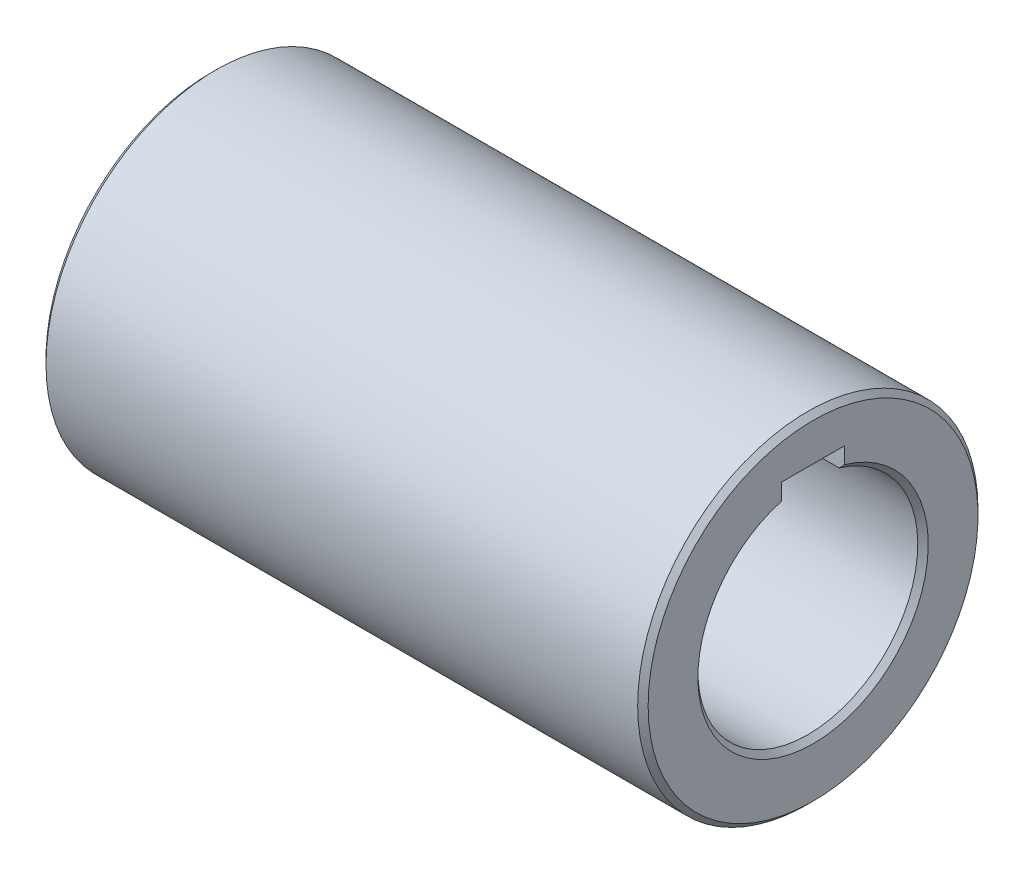
ISO-10303-21;
HEADER;
FILE_DESCRIPTION(('STEP AP214'),'2;1');
FILE_NAME('part.step','',(''),(''),'','','');
FILE_SCHEMA(('AUTOMOTIVE_DESIGN { 1 0 10303 214 1 1 1 1 }'));
ENDSEC;
DATA;
#1=APPLICATION_CONTEXT('core data for automotive mechanical design processes');
#2=APPLICATION_PROTOCOL_DEFINITION('international standard','automotive_design',2000,#1);
#3=PRODUCT_CONTEXT('',#1,'mechanical');
#4=PRODUCT('Part','Part','',(#3));
#5=PRODUCT_RELATED_PRODUCT_CATEGORY('part','',(#4));
#6=PRODUCT_DEFINITION_FORMATION('','',#4);
#7=PRODUCT_DEFINITION_CONTEXT('part definition',#1,'design');
#8=PRODUCT_DEFINITION('design','',#6,#7);
#9=PRODUCT_DEFINITION_SHAPE('','',#8);
#10=(LENGTH_UNIT() NAMED_UNIT(*) SI_UNIT(.MILLI.,.METRE.));
#11=(NAMED_UNIT(*) PLANE_ANGLE_UNIT() SI_UNIT($,.RADIAN.));
#12=(NAMED_UNIT(*) SI_UNIT($,.STERADIAN.) SOLID_ANGLE_UNIT());
#13=UNCERTAINTY_MEASURE_WITH_UNIT(LENGTH_MEASURE(1.E-05),#10,'distance_accuracy_value','');
#14=(GEOMETRIC_REPRESENTATION_CONTEXT(3) GLOBAL_UNCERTAINTY_ASSIGNED_CONTEXT((#13)) GLOBAL_UNIT_ASSIGNED_CONTEXT((#10,
#11,#12)) REPRESENTATION_CONTEXT('',''));
#15=CARTESIAN_POINT('',(0.,0.,0.));
#16=DIRECTION('',(0.,0.,1.));
#17=DIRECTION('',(1.,0.,0.));
#18=AXIS2_PLACEMENT_3D('',#15,#16,#17);
#19=CARTESIAN_POINT('',(0.,0.,0.));
#20=DIRECTION('',(-1.,0.,0.));
#21=DIRECTION('',(0.,0.,1.));
#22=AXIS2_PLACEMENT_3D('',#19,#20,#21);
#23=CYLINDRICAL_SURFACE('',#22,27.5);
#24=CARTESIAN_POINT('',(0.999999999999963,0.,0.));
#25=DIRECTION('',(1.,0.,0.));
#26=DIRECTION('',(0.,0.,-1.));
#27=AXIS2_PLACEMENT_3D('',#24,#25,#26);
#28=CIRCLE('',#27,27.5);
#29=CARTESIAN_POINT('',(0.999999999999963,0.,-27.5));
#30=VERTEX_POINT('',#29);
#31=EDGE_CURVE('E155',#30,#30,#28,.F.);
#32=ORIENTED_EDGE('',*,*,#31,.T.);
#33=EDGE_LOOP('',(#32));
#34=FACE_BOUND('',#33,.T.);
#35=CARTESIAN_POINT('',(63.,0.,0.));
#36=DIRECTION('',(-1.,0.,0.));
#37=DIRECTION('',(0.,0.,1.));
#38=AXIS2_PLACEMENT_3D('',#35,#36,#37);
#39=CIRCLE('',#38,27.5);
#40=CARTESIAN_POINT('',(63.,0.,27.5));
#41=VERTEX_POINT('',#40);
#42=EDGE_CURVE('E128',#41,#41,#39,.T.);
#43=ORIENTED_EDGE('',*,*,#42,.F.);
#44=EDGE_LOOP('',(#43));
#45=FACE_BOUND('',#44,.T.);
#46=ADVANCED_FACE('F38',(#34,#45),#23,.F.);
#47=CARTESIAN_POINT('',(0.,27.5,0.));
#48=DIRECTION('',(1.,0.,0.));
#49=DIRECTION('',(0.,0.,-1.));
#50=AXIS2_PLACEMENT_3D('',#47,#48,#49);
#51=PLANE('',#50);
#52=CARTESIAN_POINT('',(0.,0.,0.));
#53=DIRECTION('',(1.,0.,0.));
#54=DIRECTION('',(0.,0.,-1.));
#55=AXIS2_PLACEMENT_3D('',#52,#53,#54);
#56=CIRCLE('',#55,28.5);
#57=CARTESIAN_POINT('',(0.,0.,-28.5));
#58=VERTEX_POINT('',#57);
#59=EDGE_CURVE('E163',#58,#58,#56,.T.);
#60=ORIENTED_EDGE('',*,*,#59,.T.);
#61=EDGE_LOOP('',(#60));
#62=FACE_BOUND('',#61,.T.);
#63=CARTESIAN_POINT('',(0.,0.,0.));
#64=DIRECTION('',(1.,0.,0.));
#65=DIRECTION('',(0.,0.,-1.));
#66=AXIS2_PLACEMENT_3D('',#63,#64,#65);
#67=CIRCLE('',#66,31.5);
#68=CARTESIAN_POINT('',(0.,0.,-31.5));
#69=VERTEX_POINT('',#68);
#70=EDGE_CURVE('E159',#69,#69,#67,.F.);
#71=ORIENTED_EDGE('',*,*,#70,.T.);
#72=EDGE_LOOP('',(#71));
#73=FACE_BOUND('',#72,.T.);
#74=ADVANCED_FACE('F206',(#62,#73),#51,.F.);
#75=CARTESIAN_POINT('',(0.,0.,0.));
#76=DIRECTION('',(-1.,0.,0.));
#77=DIRECTION('',(0.,0.,1.));
#78=AXIS2_PLACEMENT_3D('',#75,#76,#77);
#79=CYLINDRICAL_SURFACE('',#78,32.5);
#80=CARTESIAN_POINT('',(114.,0.,0.));
#81=DIRECTION('',(-1.,0.,0.));
#82=DIRECTION('',(0.,0.,1.));
#83=AXIS2_PLACEMENT_3D('',#80,#81,#82);
#84=CIRCLE('',#83,32.5);
#85=CARTESIAN_POINT('',(114.,0.,32.5));
#86=VERTEX_POINT('',#85);
#87=EDGE_CURVE('E151',#86,#86,#84,.T.);
#88=ORIENTED_EDGE('',*,*,#87,.T.);
#89=EDGE_LOOP('',(#88));
#90=FACE_BOUND('',#89,.T.);
#91=CARTESIAN_POINT('',(0.999999999999994,0.,0.));
#92=DIRECTION('',(1.,0.,0.));
#93=DIRECTION('',(0.,0.,-1.));
#94=AXIS2_PLACEMENT_3D('',#91,#92,#93);
#95=CIRCLE('',#94,32.5);
#96=CARTESIAN_POINT('',(0.999999999999994,0.,-32.5));
#97=VERTEX_POINT('',#96);
#98=EDGE_CURVE('E147',#97,#97,#95,.T.);
#99=ORIENTED_EDGE('',*,*,#98,.T.);
#100=EDGE_LOOP('',(#99));
#101=FACE_BOUND('',#100,.T.);
#102=ADVANCED_FACE('F203',(#90,#101),#79,.T.);
#103=CARTESIAN_POINT('',(115.,21.,0.));
#104=DIRECTION('',(-1.,0.,0.));
#105=DIRECTION('',(0.,0.,1.));
#106=AXIS2_PLACEMENT_3D('',#103,#104,#105);
#107=PLANE('',#106);
#108=DIRECTION('',(0.,0.,1.));
#109=VECTOR('',#108,1.);
#110=CARTESIAN_POINT('',(115.,24.3,-6.));
#111=LINE('',#110,#109);
#112=CARTESIAN_POINT('',(115.,24.3,-6.));
#113=VERTEX_POINT('',#112);
#114=CARTESIAN_POINT('',(115.,24.3,6.));
#115=VERTEX_POINT('',#114);
#116=EDGE_CURVE('E92',#113,#115,#111,.T.);
#117=ORIENTED_EDGE('',*,*,#116,.F.);
#118=DIRECTION('',(0.,1.,0.));
#119=VECTOR('',#118,1.);
#120=CARTESIAN_POINT('',(115.,16.,-6.));
#121=LINE('',#120,#119);
#122=CARTESIAN_POINT('',(115.,21.1660104885167,-6.));
#123=VERTEX_POINT('',#122);
#124=EDGE_CURVE('E97',#123,#113,#121,.T.);
#125=ORIENTED_EDGE('',*,*,#124,.F.);
#126=CARTESIAN_POINT('',(115.,0.,0.));
#127=DIRECTION('',(-1.,0.,0.));
#128=DIRECTION('',(0.,0.,1.));
#129=AXIS2_PLACEMENT_3D('',#126,#127,#128);
#130=CIRCLE('',#129,22.);
#131=CARTESIAN_POINT('',(115.,21.1660104885167,6.));
#132=VERTEX_POINT('',#131);
#133=EDGE_CURVE('E140',#123,#132,#130,.T.);
#134=ORIENTED_EDGE('',*,*,#133,.T.);
#135=DIRECTION('',(0.,-1.,0.));
#136=VECTOR('',#135,1.);
#137=CARTESIAN_POINT('',(115.,16.,6.));
#138=LINE('',#137,#136);
#139=EDGE_CURVE('E55',#115,#132,#138,.T.);
#140=ORIENTED_EDGE('',*,*,#139,.F.);
#141=EDGE_LOOP('',(#117,#125,#134,#140));
#142=FACE_BOUND('',#141,.T.);
#143=CARTESIAN_POINT('',(115.,0.,0.));
#144=DIRECTION('',(-1.,0.,0.));
#145=DIRECTION('',(0.,0.,1.));
#146=AXIS2_PLACEMENT_3D('',#143,#144,#145);
#147=CIRCLE('',#146,31.5);
#148=CARTESIAN_POINT('',(115.,0.,31.5));
#149=VERTEX_POINT('',#148);
#150=EDGE_CURVE('E136',#149,#149,#147,.F.);
#151=ORIENTED_EDGE('',*,*,#150,.T.);
#152=EDGE_LOOP('',(#151));
#153=FACE_BOUND('',#152,.T.);
#154=ADVANCED_FACE('F105',(#142,#153),#107,.F.);
#155=CARTESIAN_POINT('',(0.,0.,0.));
#156=DIRECTION('',(-1.,0.,0.));
#157=DIRECTION('',(0.,0.,1.));
#158=AXIS2_PLACEMENT_3D('',#155,#156,#157);
#159=CYLINDRICAL_SURFACE('',#158,21.);
#160=CARTESIAN_POINT('',(114.,0.,0.));
#161=DIRECTION('',(-1.,0.,0.));
#162=DIRECTION('',(0.,0.,1.));
#163=AXIS2_PLACEMENT_3D('',#160,#161,#162);
#164=CIRCLE('',#163,21.);
#165=CARTESIAN_POINT('',(114.,20.1246117974981,6.));
#166=VERTEX_POINT('',#165);
#167=CARTESIAN_POINT('',(114.,20.1246117974981,-6.));
#168=VERTEX_POINT('',#167);
#169=EDGE_CURVE('E143',#166,#168,#164,.F.);
#170=ORIENTED_EDGE('',*,*,#169,.T.);
#171=DIRECTION('',(-1.,0.,0.));
#172=VECTOR('',#171,1.);
#173=CARTESIAN_POINT('',(0.,20.1246117974981,-6.));
#174=LINE('',#173,#172);
#175=CARTESIAN_POINT('',(63.,20.1246117974981,-6.));
#176=VERTEX_POINT('',#175);
#177=EDGE_CURVE('E123',#168,#176,#174,.T.);
#178=ORIENTED_EDGE('',*,*,#177,.T.);
#179=CARTESIAN_POINT('',(63.,0.,0.));
#180=DIRECTION('',(-1.,0.,0.));
#181=DIRECTION('',(0.,0.,1.));
#182=AXIS2_PLACEMENT_3D('',#179,#180,#181);
#183=CIRCLE('',#182,21.);
#184=CARTESIAN_POINT('',(63.,20.1246117974981,6.));
#185=VERTEX_POINT('',#184);
#186=EDGE_CURVE('E132',#176,#185,#183,.T.);
#187=ORIENTED_EDGE('',*,*,#186,.T.);
#188=DIRECTION('',(-1.,0.,0.));
#189=VECTOR('',#188,1.);
#190=CARTESIAN_POINT('',(0.,20.1246117974981,6.));
#191=LINE('',#190,#189);
#192=EDGE_CURVE('E114',#185,#166,#191,.F.);
#193=ORIENTED_EDGE('',*,*,#192,.T.);
#194=EDGE_LOOP('',(#170,#178,#187,#193));
#195=FACE_BOUND('',#194,.T.);
#196=ADVANCED_FACE('F196',(#195),#159,.F.);
#197=CARTESIAN_POINT('',(63.,27.5,0.));
#198=DIRECTION('',(1.,0.,0.));
#199=DIRECTION('',(0.,0.,-1.));
#200=AXIS2_PLACEMENT_3D('',#197,#198,#199);
#201=PLANE('',#200);
#202=ORIENTED_EDGE('',*,*,#186,.F.);
#203=DIRECTION('',(0.,1.,0.));
#204=VECTOR('',#203,1.);
#205=CARTESIAN_POINT('',(63.,27.5,-6.));
#206=LINE('',#205,#204);
#207=CARTESIAN_POINT('',(63.,24.3,-6.));
#208=VERTEX_POINT('',#207);
#209=EDGE_CURVE('E63',#176,#208,#206,.T.);
#210=ORIENTED_EDGE('',*,*,#209,.T.);
#211=DIRECTION('',(0.,0.,1.));
#212=VECTOR('',#211,1.);
#213=CARTESIAN_POINT('',(63.,24.3,0.));
#214=LINE('',#213,#212);
#215=CARTESIAN_POINT('',(63.,24.3,6.));
#216=VERTEX_POINT('',#215);
#217=EDGE_CURVE('E11',#208,#216,#214,.T.);
#218=ORIENTED_EDGE('',*,*,#217,.T.);
#219=DIRECTION('',(0.,-1.,0.));
#220=VECTOR('',#219,1.);
#221=CARTESIAN_POINT('',(63.,27.5,6.));
#222=LINE('',#221,#220);
#223=EDGE_CURVE('E119',#216,#185,#222,.T.);
#224=ORIENTED_EDGE('',*,*,#223,.T.);
#225=EDGE_LOOP('',(#202,#210,#218,#224));
#226=FACE_BOUND('',#225,.T.);
#227=ORIENTED_EDGE('',*,*,#42,.T.);
#228=EDGE_LOOP('',(#227));
#229=FACE_BOUND('',#228,.T.);
#230=ADVANCED_FACE('F193',(#226,#229),#201,.F.);
#231=CARTESIAN_POINT('',(115.,0.,0.));
#232=DIRECTION('',(1.,0.,0.));
#233=DIRECTION('',(0.,0.,-1.));
#234=AXIS2_PLACEMENT_3D('',#231,#232,#233);
#235=CONICAL_SURFACE('',#234,22.,0.785398163397445);
#236=CARTESIAN_POINT('',(107.917037469702,13.6571595462779,-6.));
#237=CARTESIAN_POINT('',(108.185169465987,13.9500097881322,-6.));
#238=CARTESIAN_POINT('',(108.454042430695,14.2421797525251,-6.));
#239=CARTESIAN_POINT('',(108.993064652202,14.8253372360777,-6.));
#240=CARTESIAN_POINT('',(109.263213901869,15.1163247618273,-6.));
#241=CARTESIAN_POINT('',(109.804580459783,15.6972927477288,-6.));
#242=CARTESIAN_POINT('',(110.075797745874,15.9872732285393,-6.));
#243=CARTESIAN_POINT('',(110.619154078413,16.5663699176533,-6.));
#244=CARTESIAN_POINT('',(110.891293126352,16.855486124557,-6.));
#245=CARTESIAN_POINT('',(111.708863977728,17.7216841881823,-6.));
#246=CARTESIAN_POINT('',(112.25548011204,18.2976482901069,-6.));
#247=CARTESIAN_POINT('',(113.351102236773,19.4473032313742,-6.));
#248=CARTESIAN_POINT('',(113.900108241998,20.0209940565921,-6.));
#249=CARTESIAN_POINT('',(114.999949542925,21.1665642341172,-6.));
#250=CARTESIAN_POINT('',(115.550784746656,21.7384436747571,-6.));
#251=CARTESIAN_POINT('',(116.653926148128,22.8807821014784,-6.));
#252=CARTESIAN_POINT('',(117.206232346738,23.4512410867213,-6.));
#253=CARTESIAN_POINT('',(118.312056434325,24.5910415798011,-6.));
#254=CARTESIAN_POINT('',(118.865574385813,25.1603830269714,-6.));
#255=CARTESIAN_POINT('',(119.973587219625,26.2981148054165,-6.));
#256=CARTESIAN_POINT('',(120.52808210211,26.8665051365345,-6.));
#257=CARTESIAN_POINT('',(121.082962530298,27.4345181200277,-6.));
#258=B_SPLINE_CURVE_WITH_KNOTS('',3,(#236,#237,#238,#239,#240,#241,#242,#243,#244,#245,#246,
#247,#248,#249,#250,#251,#252,#253,#254,#255,#256,#257),.UNSPECIFIED.,.F.,.F.,(4,2,2,2,2,2,2,2,
2,2,4),(0.,1.19117443272705,2.38234221774085,3.57348542086152,4.76463055209766,7.14678619121553,
9.52895660857309,11.9110090126714,14.2930628224653,16.6752425534105,19.0574226769363),.UNSPECIFIED.);
#259=EDGE_CURVE('E48',#168,#123,#258,.T.);
#260=ORIENTED_EDGE('',*,*,#259,.F.);
#261=ORIENTED_EDGE('',*,*,#169,.F.);
#262=CARTESIAN_POINT('',(121.082962530298,27.4345181200277,6.));
#263=CARTESIAN_POINT('',(120.52808210211,26.8665051365345,6.));
#264=CARTESIAN_POINT('',(119.973587219625,26.2981148054165,6.));
#265=CARTESIAN_POINT('',(118.865574385813,25.1603830269714,6.));
#266=CARTESIAN_POINT('',(118.312056434325,24.5910415798011,6.));
#267=CARTESIAN_POINT('',(117.206232346738,23.4512410867213,6.));
#268=CARTESIAN_POINT('',(116.653926148128,22.8807821014784,6.));
#269=CARTESIAN_POINT('',(115.550784746656,21.7384436747571,6.));
#270=CARTESIAN_POINT('',(114.999949542925,21.1665642341171,6.));
#271=CARTESIAN_POINT('',(113.900108241998,20.0209940565921,6.));
#272=CARTESIAN_POINT('',(113.351102236773,19.4473032313742,6.));
#273=CARTESIAN_POINT('',(112.25548011204,18.2976482901069,6.));
#274=CARTESIAN_POINT('',(111.708863977728,17.7216841881822,6.));
#275=CARTESIAN_POINT('',(110.891293126352,16.855486124557,6.));
#276=CARTESIAN_POINT('',(110.619154078413,16.5663699176533,6.));
#277=CARTESIAN_POINT('',(110.075797745874,15.9872732285393,6.));
#278=CARTESIAN_POINT('',(109.804580459783,15.6972927477287,6.));
#279=CARTESIAN_POINT('',(109.263213901869,15.1163247618273,6.));
#280=CARTESIAN_POINT('',(108.993064652202,14.8253372360777,6.));
#281=CARTESIAN_POINT('',(108.454042430695,14.242179752525,6.));
#282=CARTESIAN_POINT('',(108.185169465987,13.9500097881321,6.));
#283=CARTESIAN_POINT('',(107.917037469702,13.6571595462779,6.));
#284=B_SPLINE_CURVE_WITH_KNOTS('',3,(#262,#263,#264,#265,#266,#267,#268,#269,#270,#271,#272,
#273,#274,#275,#276,#277,#278,#279,#280,#281,#282,#283),.UNSPECIFIED.,.F.,.F.,(4,2,2,2,2,2,2,2,
2,2,4),(0.,2.38218012352581,4.76435985447098,7.14641366426495,9.52846606836322,11.9106364857208,
14.2927921248387,15.4839372560748,16.6750804591954,17.8662482442093,19.0574226769363),.UNSPECIFIED.);
#285=EDGE_CURVE('E167',#132,#166,#284,.T.);
#286=ORIENTED_EDGE('',*,*,#285,.F.);
#287=ORIENTED_EDGE('',*,*,#133,.F.);
#288=EDGE_LOOP('',(#260,#261,#286,#287));
#289=FACE_BOUND('',#288,.T.);
#290=ADVANCED_FACE('F181',(#289),#235,.F.);
#291=CARTESIAN_POINT('',(114.,0.,0.));
#292=DIRECTION('',(-1.,0.,0.));
#293=DIRECTION('',(0.,0.,1.));
#294=AXIS2_PLACEMENT_3D('',#291,#292,#293);
#295=CONICAL_SURFACE('',#294,32.5,0.785398163397438);
#296=ORIENTED_EDGE('',*,*,#150,.F.);
#297=EDGE_LOOP('',(#296));
#298=FACE_BOUND('',#297,.T.);
#299=ORIENTED_EDGE('',*,*,#87,.F.);
#300=EDGE_LOOP('',(#299));
#301=FACE_BOUND('',#300,.T.);
#302=ADVANCED_FACE('F221',(#298,#301),#295,.T.);
#303=CARTESIAN_POINT('',(0.999999999999963,0.,0.));
#304=DIRECTION('',(-1.,0.,0.));
#305=DIRECTION('',(0.,0.,1.));
#306=AXIS2_PLACEMENT_3D('',#303,#304,#305);
#307=CONICAL_SURFACE('',#306,27.5,0.785398163397462);
#308=ORIENTED_EDGE('',*,*,#59,.F.);
#309=EDGE_LOOP('',(#308));
#310=FACE_BOUND('',#309,.T.);
#311=ORIENTED_EDGE('',*,*,#31,.F.);
#312=EDGE_LOOP('',(#311));
#313=FACE_BOUND('',#312,.T.);
#314=ADVANCED_FACE('F219',(#310,#313),#307,.F.);
#315=CARTESIAN_POINT('',(0.,0.,0.));
#316=DIRECTION('',(1.,0.,0.));
#317=DIRECTION('',(0.,0.,-1.));
#318=AXIS2_PLACEMENT_3D('',#315,#316,#317);
#319=CONICAL_SURFACE('',#318,31.5,0.785398163397448);
#320=ORIENTED_EDGE('',*,*,#98,.F.);
#321=EDGE_LOOP('',(#320));
#322=FACE_BOUND('',#321,.T.);
#323=ORIENTED_EDGE('',*,*,#70,.F.);
#324=EDGE_LOOP('',(#323));
#325=FACE_BOUND('',#324,.T.);
#326=ADVANCED_FACE('F41',(#322,#325),#319,.T.);
#327=CARTESIAN_POINT('',(15.,24.3,-6.));
#328=DIRECTION('',(0.,1.,0.));
#329=DIRECTION('',(0.,0.,1.));
#330=AXIS2_PLACEMENT_3D('',#327,#328,#329);
#331=PLANE('',#330);
#332=DIRECTION('',(1.,0.,0.));
#333=VECTOR('',#332,1.);
#334=CARTESIAN_POINT('',(15.,24.3,-6.));
#335=LINE('',#334,#333);
#336=EDGE_CURVE('E87',#208,#113,#335,.T.);
#337=ORIENTED_EDGE('',*,*,#336,.T.);
#338=ORIENTED_EDGE('',*,*,#116,.T.);
#339=DIRECTION('',(1.,0.,0.));
#340=VECTOR('',#339,1.);
#341=CARTESIAN_POINT('',(15.,24.3,6.));
#342=LINE('',#341,#340);
#343=EDGE_CURVE('E94',#216,#115,#342,.T.);
#344=ORIENTED_EDGE('',*,*,#343,.F.);
#345=ORIENTED_EDGE('',*,*,#217,.F.);
#346=EDGE_LOOP('',(#337,#338,#344,#345));
#347=FACE_BOUND('',#346,.T.);
#348=ADVANCED_FACE('F89',(#347),#331,.F.);
#349=CARTESIAN_POINT('',(15.,16.,-6.));
#350=DIRECTION('',(0.,0.,-1.));
#351=DIRECTION('',(-1.,0.,0.));
#352=AXIS2_PLACEMENT_3D('',#349,#350,#351);
#353=PLANE('',#352);
#354=ORIENTED_EDGE('',*,*,#177,.F.);
#355=ORIENTED_EDGE('',*,*,#259,.T.);
#356=ORIENTED_EDGE('',*,*,#124,.T.);
#357=ORIENTED_EDGE('',*,*,#336,.F.);
#358=ORIENTED_EDGE('',*,*,#209,.F.);
#359=EDGE_LOOP('',(#354,#355,#356,#357,#358));
#360=FACE_BOUND('',#359,.T.);
#361=ADVANCED_FACE('F98',(#360),#353,.F.);
#362=CARTESIAN_POINT('',(15.,16.,6.));
#363=DIRECTION('',(0.,0.,1.));
#364=DIRECTION('',(0.,-1.,0.));
#365=AXIS2_PLACEMENT_3D('',#362,#363,#364);
#366=PLANE('',#365);
#367=ORIENTED_EDGE('',*,*,#343,.T.);
#368=ORIENTED_EDGE('',*,*,#139,.T.);
#369=ORIENTED_EDGE('',*,*,#285,.T.);
#370=ORIENTED_EDGE('',*,*,#192,.F.);
#371=ORIENTED_EDGE('',*,*,#223,.F.);
#372=EDGE_LOOP('',(#367,#368,#369,#370,#371));
#373=FACE_BOUND('',#372,.T.);
#374=ADVANCED_FACE('F185',(#373),#366,.F.);
#375=CLOSED_SHELL('',(#46,#74,#102,#154,#196,#230,#290,#302,#314,#326,#348,#361,#374));
#376=MANIFOLD_SOLID_BREP('B2',#375);
#377=ADVANCED_BREP_SHAPE_REPRESENTATION('',(#18,#376),#14);
#378=SHAPE_DEFINITION_REPRESENTATION(#9,#377);
ENDSEC;
END-ISO-10303-21;
